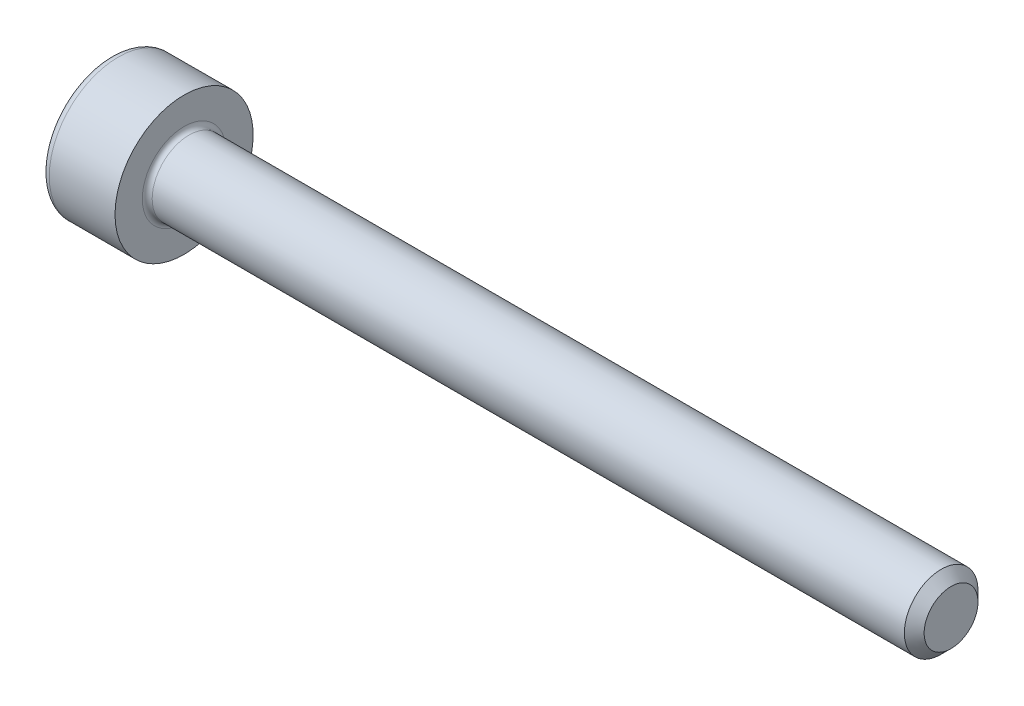
ISO-10303-21;
HEADER;
FILE_DESCRIPTION(('STEP AP214'),'2;1');
FILE_NAME('part.step','',(''),(''),'','','');
FILE_SCHEMA(('AUTOMOTIVE_DESIGN { 1 0 10303 214 1 1 1 1 }'));
ENDSEC;
DATA;
#1=APPLICATION_CONTEXT('core data for automotive mechanical design processes');
#2=APPLICATION_PROTOCOL_DEFINITION('international standard','automotive_design',2000,#1);
#3=PRODUCT_CONTEXT('',#1,'mechanical');
#4=PRODUCT('Part','Part','',(#3));
#5=PRODUCT_RELATED_PRODUCT_CATEGORY('part','',(#4));
#6=PRODUCT_DEFINITION_FORMATION('','',#4);
#7=PRODUCT_DEFINITION_CONTEXT('part definition',#1,'design');
#8=PRODUCT_DEFINITION('design','',#6,#7);
#9=PRODUCT_DEFINITION_SHAPE('','',#8);
#10=(LENGTH_UNIT() NAMED_UNIT(*) SI_UNIT(.MILLI.,.METRE.));
#11=(NAMED_UNIT(*) PLANE_ANGLE_UNIT() SI_UNIT($,.RADIAN.));
#12=(NAMED_UNIT(*) SI_UNIT($,.STERADIAN.) SOLID_ANGLE_UNIT());
#13=UNCERTAINTY_MEASURE_WITH_UNIT(LENGTH_MEASURE(1.E-05),#10,'distance_accuracy_value','');
#14=(GEOMETRIC_REPRESENTATION_CONTEXT(3) GLOBAL_UNCERTAINTY_ASSIGNED_CONTEXT((#13)) GLOBAL_UNIT_ASSIGNED_CONTEXT((#10,
#11,#12)) REPRESENTATION_CONTEXT('',''));
#15=CARTESIAN_POINT('',(0.,0.,0.));
#16=DIRECTION('',(0.,0.,1.));
#17=DIRECTION('',(1.,0.,0.));
#18=AXIS2_PLACEMENT_3D('',#15,#16,#17);
#19=CARTESIAN_POINT('',(0.,0.,0.));
#20=DIRECTION('',(-1.,0.,0.));
#21=DIRECTION('',(0.,0.,1.));
#22=AXIS2_PLACEMENT_3D('',#19,#20,#21);
#23=CYLINDRICAL_SURFACE('',#22,1.39568824458778);
#24=CARTESIAN_POINT('',(0.16,0.,0.));
#25=DIRECTION('',(1.,0.,0.));
#26=DIRECTION('',(0.,0.,-1.));
#27=AXIS2_PLACEMENT_3D('',#24,#25,#26);
#28=CIRCLE('',#27,1.39568824458778);
#29=CARTESIAN_POINT('',(0.16,0.,-1.39568824458778));
#30=VERTEX_POINT('',#29);
#31=EDGE_CURVE('E158',#30,#30,#28,.T.);
#32=ORIENTED_EDGE('',*,*,#31,.T.);
#33=EDGE_LOOP('',(#32));
#34=FACE_BOUND('',#33,.T.);
#35=CARTESIAN_POINT('',(1.48873412756029,0.,0.));
#36=DIRECTION('',(-1.,0.,0.));
#37=DIRECTION('',(0.,0.,1.));
#38=AXIS2_PLACEMENT_3D('',#35,#36,#37);
#39=CIRCLE('',#38,1.39568824458778);
#40=CARTESIAN_POINT('',(1.48873412756029,0.,1.39568824458778));
#41=VERTEX_POINT('',#40);
#42=EDGE_CURVE('E141',#41,#41,#39,.T.);
#43=ORIENTED_EDGE('',*,*,#42,.T.);
#44=EDGE_LOOP('',(#43));
#45=FACE_BOUND('',#44,.T.);
#46=ADVANCED_FACE('F39',(#34,#45),#23,.T.);
#47=CARTESIAN_POINT('',(0.,0.,0.));
#48=DIRECTION('',(1.,0.,0.));
#49=DIRECTION('',(0.,0.,-1.));
#50=AXIS2_PLACEMENT_3D('',#47,#48,#49);
#51=PLANE('',#50);
#52=DIRECTION('',(0.,-0.5,-0.866025403784439));
#53=VECTOR('',#52,1.);
#54=CARTESIAN_POINT('',(0.,0.877572409168232,0.));
#55=LINE('',#54,#53);
#56=CARTESIAN_POINT('',(0.,0.877572409168232,0.));
#57=VERTEX_POINT('',#56);
#58=CARTESIAN_POINT('',(0.,0.438786204584116,-0.760000000000001));
#59=VERTEX_POINT('',#58);
#60=EDGE_CURVE('E128',#57,#59,#55,.T.);
#61=ORIENTED_EDGE('',*,*,#60,.F.);
#62=DIRECTION('',(0.,0.5,-0.866025403784439));
#63=VECTOR('',#62,1.);
#64=CARTESIAN_POINT('',(0.,0.438786204584116,0.76));
#65=LINE('',#64,#63);
#66=CARTESIAN_POINT('',(0.,0.438786204584116,0.76));
#67=VERTEX_POINT('',#66);
#68=EDGE_CURVE('E54',#67,#57,#65,.T.);
#69=ORIENTED_EDGE('',*,*,#68,.F.);
#70=DIRECTION('',(0.,1.,0.));
#71=VECTOR('',#70,1.);
#72=CARTESIAN_POINT('',(0.,-0.438786204584116,0.76));
#73=LINE('',#72,#71);
#74=CARTESIAN_POINT('',(0.,-0.438786204584116,0.76));
#75=VERTEX_POINT('',#74);
#76=EDGE_CURVE('E137',#75,#67,#73,.T.);
#77=ORIENTED_EDGE('',*,*,#76,.F.);
#78=DIRECTION('',(0.,0.5,0.866025403784439));
#79=VECTOR('',#78,1.);
#80=CARTESIAN_POINT('',(0.,-0.877572409168232,0.));
#81=LINE('',#80,#79);
#82=CARTESIAN_POINT('',(0.,-0.877572409168232,0.));
#83=VERTEX_POINT('',#82);
#84=EDGE_CURVE('E135',#83,#75,#81,.T.);
#85=ORIENTED_EDGE('',*,*,#84,.F.);
#86=DIRECTION('',(0.,-0.5,0.866025403784438));
#87=VECTOR('',#86,1.);
#88=CARTESIAN_POINT('',(0.,-0.438786204584116,-0.760000000000001));
#89=LINE('',#88,#87);
#90=CARTESIAN_POINT('',(0.,-0.438786204584116,-0.760000000000001));
#91=VERTEX_POINT('',#90);
#92=EDGE_CURVE('E102',#91,#83,#89,.T.);
#93=ORIENTED_EDGE('',*,*,#92,.F.);
#94=DIRECTION('',(0.,-1.,0.));
#95=VECTOR('',#94,1.);
#96=CARTESIAN_POINT('',(0.,0.438786204584116,-0.760000000000001));
#97=LINE('',#96,#95);
#98=EDGE_CURVE('E131',#59,#91,#97,.T.);
#99=ORIENTED_EDGE('',*,*,#98,.F.);
#100=EDGE_LOOP('',(#61,#69,#77,#85,#93,#99));
#101=FACE_BOUND('',#100,.T.);
#102=CARTESIAN_POINT('',(0.,0.,0.));
#103=DIRECTION('',(1.,0.,0.));
#104=DIRECTION('',(0.,0.,-1.));
#105=AXIS2_PLACEMENT_3D('',#102,#103,#104);
#106=CIRCLE('',#105,1.23568824458778);
#107=CARTESIAN_POINT('',(0.,0.,-1.23568824458778));
#108=VERTEX_POINT('',#107);
#109=EDGE_CURVE('E155',#108,#108,#106,.F.);
#110=ORIENTED_EDGE('',*,*,#109,.T.);
#111=EDGE_LOOP('',(#110));
#112=FACE_BOUND('',#111,.T.);
#113=ADVANCED_FACE('F180',(#101,#112),#51,.F.);
#114=CARTESIAN_POINT('',(16.9887341275603,0.,0.));
#115=DIRECTION('',(-1.,0.,0.));
#116=DIRECTION('',(0.,0.,1.));
#117=AXIS2_PLACEMENT_3D('',#114,#115,#116);
#118=PLANE('',#117);
#119=CARTESIAN_POINT('',(16.9887341275603,0.,0.));
#120=DIRECTION('',(-1.,0.,0.));
#121=DIRECTION('',(0.,0.,1.));
#122=AXIS2_PLACEMENT_3D('',#119,#120,#121);
#123=CIRCLE('',#122,0.544367063780152);
#124=CARTESIAN_POINT('',(16.9887341275603,0.,0.544367063780152));
#125=VERTEX_POINT('',#124);
#126=EDGE_CURVE('E11',#125,#125,#123,.F.);
#127=ORIENTED_EDGE('',*,*,#126,.T.);
#128=EDGE_LOOP('',(#127));
#129=FACE_BOUND('',#128,.T.);
#130=ADVANCED_FACE('F186',(#129),#118,.F.);
#131=CARTESIAN_POINT('',(0.,0.,0.));
#132=DIRECTION('',(-1.,0.,0.));
#133=DIRECTION('',(0.,0.,1.));
#134=AXIS2_PLACEMENT_3D('',#131,#132,#133);
#135=CYLINDRICAL_SURFACE('',#134,0.744367063780147);
#136=CARTESIAN_POINT('',(16.7887341275603,0.,0.));
#137=DIRECTION('',(-1.,0.,0.));
#138=DIRECTION('',(0.,0.,1.));
#139=AXIS2_PLACEMENT_3D('',#136,#137,#138);
#140=CIRCLE('',#139,0.744367063780147);
#141=CARTESIAN_POINT('',(16.7887341275603,0.,0.744367063780147));
#142=VERTEX_POINT('',#141);
#143=EDGE_CURVE('E47',#142,#142,#140,.T.);
#144=ORIENTED_EDGE('',*,*,#143,.T.);
#145=EDGE_LOOP('',(#144));
#146=FACE_BOUND('',#145,.T.);
#147=CARTESIAN_POINT('',(1.58873412756029,0.,0.));
#148=DIRECTION('',(-1.,0.,0.));
#149=DIRECTION('',(0.,0.,1.));
#150=AXIS2_PLACEMENT_3D('',#147,#148,#149);
#151=CIRCLE('',#150,0.744367063780147);
#152=CARTESIAN_POINT('',(1.58873412756029,0.,0.744367063780147));
#153=VERTEX_POINT('',#152);
#154=EDGE_CURVE('E152',#153,#153,#151,.F.);
#155=ORIENTED_EDGE('',*,*,#154,.T.);
#156=EDGE_LOOP('',(#155));
#157=FACE_BOUND('',#156,.T.);
#158=ADVANCED_FACE('F163',(#146,#157),#135,.T.);
#159=CARTESIAN_POINT('',(1.48873412756029,0.,0.));
#160=DIRECTION('',(-1.,0.,0.));
#161=DIRECTION('',(0.,0.,1.));
#162=AXIS2_PLACEMENT_3D('',#159,#160,#161);
#163=PLANE('',#162);
#164=CARTESIAN_POINT('',(1.48873412756029,0.,0.));
#165=DIRECTION('',(-1.,0.,0.));
#166=DIRECTION('',(0.,0.,1.));
#167=AXIS2_PLACEMENT_3D('',#164,#165,#166);
#168=CIRCLE('',#167,0.844367063780147);
#169=CARTESIAN_POINT('',(1.48873412756029,0.,0.844367063780147));
#170=VERTEX_POINT('',#169);
#171=EDGE_CURVE('E149',#170,#170,#168,.T.);
#172=ORIENTED_EDGE('',*,*,#171,.T.);
#173=EDGE_LOOP('',(#172));
#174=FACE_BOUND('',#173,.T.);
#175=ORIENTED_EDGE('',*,*,#42,.F.);
#176=EDGE_LOOP('',(#175));
#177=FACE_BOUND('',#176,.T.);
#178=ADVANCED_FACE('F193',(#174,#177),#163,.F.);
#179=CARTESIAN_POINT('',(1.58873412756029,0.,0.));
#180=DIRECTION('',(-1.,0.,0.));
#181=DIRECTION('',(0.,0.,1.));
#182=AXIS2_PLACEMENT_3D('',#179,#180,#181);
#183=TOROIDAL_SURFACE('',#182,0.844367063780147,0.1);
#184=ORIENTED_EDGE('',*,*,#154,.F.);
#185=EDGE_LOOP('',(#184));
#186=FACE_BOUND('',#185,.T.);
#187=ORIENTED_EDGE('',*,*,#171,.F.);
#188=EDGE_LOOP('',(#187));
#189=FACE_BOUND('',#188,.T.);
#190=ADVANCED_FACE('F176',(#186,#189),#183,.F.);
#191=CARTESIAN_POINT('',(0.16,0.,0.));
#192=DIRECTION('',(1.,0.,0.));
#193=DIRECTION('',(0.,0.,-1.));
#194=AXIS2_PLACEMENT_3D('',#191,#192,#193);
#195=TOROIDAL_SURFACE('',#194,1.23568824458778,0.16);
#196=ORIENTED_EDGE('',*,*,#31,.F.);
#197=EDGE_LOOP('',(#196));
#198=FACE_BOUND('',#197,.T.);
#199=ORIENTED_EDGE('',*,*,#109,.F.);
#200=EDGE_LOOP('',(#199));
#201=FACE_BOUND('',#200,.T.);
#202=ADVANCED_FACE('F168',(#198,#201),#195,.T.);
#203=CARTESIAN_POINT('',(16.7887341275603,0.,0.));
#204=DIRECTION('',(-1.,0.,0.));
#205=DIRECTION('',(0.,0.,1.));
#206=AXIS2_PLACEMENT_3D('',#203,#204,#205);
#207=CONICAL_SURFACE('',#206,0.744367063780147,0.78539816339744);
#208=ORIENTED_EDGE('',*,*,#126,.F.);
#209=EDGE_LOOP('',(#208));
#210=FACE_BOUND('',#209,.T.);
#211=ORIENTED_EDGE('',*,*,#143,.F.);
#212=EDGE_LOOP('',(#211));
#213=FACE_BOUND('',#212,.T.);
#214=ADVANCED_FACE('F41',(#210,#213),#207,.T.);
#215=CARTESIAN_POINT('',(0.7,0.438786204584116,0.76));
#216=DIRECTION('',(0.,0.866025403784439,0.5));
#217=DIRECTION('',(0.,-0.5,0.866025403784439));
#218=AXIS2_PLACEMENT_3D('',#215,#216,#217);
#219=PLANE('',#218);
#220=ORIENTED_EDGE('',*,*,#68,.T.);
#221=DIRECTION('',(-1.,0.,0.));
#222=VECTOR('',#221,1.);
#223=CARTESIAN_POINT('',(0.7,0.877572409168232,0.));
#224=LINE('',#223,#222);
#225=CARTESIAN_POINT('',(0.7,0.877572409168232,0.));
#226=VERTEX_POINT('',#225);
#227=EDGE_CURVE('E84',#226,#57,#224,.T.);
#228=ORIENTED_EDGE('',*,*,#227,.F.);
#229=DIRECTION('',(0.,0.5,-0.866025403784439));
#230=VECTOR('',#229,1.);
#231=CARTESIAN_POINT('',(0.7,0.438786204584116,0.76));
#232=LINE('',#231,#230);
#233=CARTESIAN_POINT('',(0.7,0.438786204584116,0.76));
#234=VERTEX_POINT('',#233);
#235=EDGE_CURVE('E139',#234,#226,#232,.T.);
#236=ORIENTED_EDGE('',*,*,#235,.F.);
#237=DIRECTION('',(-1.,0.,0.));
#238=VECTOR('',#237,1.);
#239=CARTESIAN_POINT('',(0.7,0.438786204584116,0.76));
#240=LINE('',#239,#238);
#241=EDGE_CURVE('E62',#234,#67,#240,.T.);
#242=ORIENTED_EDGE('',*,*,#241,.T.);
#243=EDGE_LOOP('',(#220,#228,#236,#242));
#244=FACE_BOUND('',#243,.T.);
#245=ADVANCED_FACE('F167',(#244),#219,.F.);
#246=CARTESIAN_POINT('',(0.7,-0.438786204584116,0.76));
#247=DIRECTION('',(0.,0.,1.));
#248=DIRECTION('',(1.,0.,0.));
#249=AXIS2_PLACEMENT_3D('',#246,#247,#248);
#250=PLANE('',#249);
#251=ORIENTED_EDGE('',*,*,#76,.T.);
#252=ORIENTED_EDGE('',*,*,#241,.F.);
#253=DIRECTION('',(0.,1.,0.));
#254=VECTOR('',#253,1.);
#255=CARTESIAN_POINT('',(0.7,-0.438786204584116,0.76));
#256=LINE('',#255,#254);
#257=CARTESIAN_POINT('',(0.7,-0.438786204584116,0.76));
#258=VERTEX_POINT('',#257);
#259=EDGE_CURVE('E114',#258,#234,#256,.T.);
#260=ORIENTED_EDGE('',*,*,#259,.F.);
#261=DIRECTION('',(-1.,0.,0.));
#262=VECTOR('',#261,1.);
#263=CARTESIAN_POINT('',(0.7,-0.438786204584116,0.76));
#264=LINE('',#263,#262);
#265=EDGE_CURVE('E106',#258,#75,#264,.T.);
#266=ORIENTED_EDGE('',*,*,#265,.T.);
#267=EDGE_LOOP('',(#251,#252,#260,#266));
#268=FACE_BOUND('',#267,.T.);
#269=ADVANCED_FACE('F174',(#268),#250,.F.);
#270=CARTESIAN_POINT('',(0.7,-0.877572409168232,0.));
#271=DIRECTION('',(0.,-0.866025403784439,0.5));
#272=DIRECTION('',(0.,-0.5,-0.866025403784439));
#273=AXIS2_PLACEMENT_3D('',#270,#271,#272);
#274=PLANE('',#273);
#275=ORIENTED_EDGE('',*,*,#84,.T.);
#276=ORIENTED_EDGE('',*,*,#265,.F.);
#277=DIRECTION('',(0.,0.5,0.866025403784439));
#278=VECTOR('',#277,1.);
#279=CARTESIAN_POINT('',(0.7,-0.877572409168232,0.));
#280=LINE('',#279,#278);
#281=CARTESIAN_POINT('',(0.7,-0.877572409168232,0.));
#282=VERTEX_POINT('',#281);
#283=EDGE_CURVE('E110',#282,#258,#280,.T.);
#284=ORIENTED_EDGE('',*,*,#283,.F.);
#285=DIRECTION('',(-1.,0.,0.));
#286=VECTOR('',#285,1.);
#287=CARTESIAN_POINT('',(0.7,-0.877572409168232,0.));
#288=LINE('',#287,#286);
#289=EDGE_CURVE('E95',#282,#83,#288,.T.);
#290=ORIENTED_EDGE('',*,*,#289,.T.);
#291=EDGE_LOOP('',(#275,#276,#284,#290));
#292=FACE_BOUND('',#291,.T.);
#293=ADVANCED_FACE('F111',(#292),#274,.F.);
#294=CARTESIAN_POINT('',(0.7,-0.438786204584116,-0.760000000000001));
#295=DIRECTION('',(0.,-0.866025403784438,-0.5));
#296=DIRECTION('',(0.,0.5,-0.866025403784438));
#297=AXIS2_PLACEMENT_3D('',#294,#295,#296);
#298=PLANE('',#297);
#299=ORIENTED_EDGE('',*,*,#92,.T.);
#300=ORIENTED_EDGE('',*,*,#289,.F.);
#301=DIRECTION('',(0.,-0.5,0.866025403784438));
#302=VECTOR('',#301,1.);
#303=CARTESIAN_POINT('',(0.7,-0.438786204584116,-0.760000000000001));
#304=LINE('',#303,#302);
#305=CARTESIAN_POINT('',(0.7,-0.438786204584116,-0.760000000000001));
#306=VERTEX_POINT('',#305);
#307=EDGE_CURVE('E99',#306,#282,#304,.T.);
#308=ORIENTED_EDGE('',*,*,#307,.F.);
#309=DIRECTION('',(-1.,0.,0.));
#310=VECTOR('',#309,1.);
#311=CARTESIAN_POINT('',(0.7,-0.438786204584116,-0.760000000000001));
#312=LINE('',#311,#310);
#313=EDGE_CURVE('E107',#306,#91,#312,.T.);
#314=ORIENTED_EDGE('',*,*,#313,.T.);
#315=EDGE_LOOP('',(#299,#300,#308,#314));
#316=FACE_BOUND('',#315,.T.);
#317=ADVANCED_FACE('F97',(#316),#298,.F.);
#318=CARTESIAN_POINT('',(0.7,0.438786204584116,-0.760000000000001));
#319=DIRECTION('',(0.,0.,-1.));
#320=DIRECTION('',(0.,1.,0.));
#321=AXIS2_PLACEMENT_3D('',#318,#319,#320);
#322=PLANE('',#321);
#323=ORIENTED_EDGE('',*,*,#98,.T.);
#324=ORIENTED_EDGE('',*,*,#313,.F.);
#325=DIRECTION('',(0.,-1.,0.));
#326=VECTOR('',#325,1.);
#327=CARTESIAN_POINT('',(0.7,0.438786204584116,-0.760000000000001));
#328=LINE('',#327,#326);
#329=CARTESIAN_POINT('',(0.7,0.438786204584116,-0.760000000000001));
#330=VERTEX_POINT('',#329);
#331=EDGE_CURVE('E120',#330,#306,#328,.T.);
#332=ORIENTED_EDGE('',*,*,#331,.F.);
#333=DIRECTION('',(-1.,0.,0.));
#334=VECTOR('',#333,1.);
#335=CARTESIAN_POINT('',(0.7,0.438786204584116,-0.760000000000001));
#336=LINE('',#335,#334);
#337=EDGE_CURVE('E144',#330,#59,#336,.T.);
#338=ORIENTED_EDGE('',*,*,#337,.T.);
#339=EDGE_LOOP('',(#323,#324,#332,#338));
#340=FACE_BOUND('',#339,.T.);
#341=ADVANCED_FACE('F215',(#340),#322,.F.);
#342=CARTESIAN_POINT('',(0.7,0.877572409168232,0.));
#343=DIRECTION('',(0.,0.866025403784439,-0.5));
#344=DIRECTION('',(0.,0.5,0.866025403784439));
#345=AXIS2_PLACEMENT_3D('',#342,#343,#344);
#346=PLANE('',#345);
#347=ORIENTED_EDGE('',*,*,#60,.T.);
#348=ORIENTED_EDGE('',*,*,#337,.F.);
#349=DIRECTION('',(0.,-0.5,-0.866025403784439));
#350=VECTOR('',#349,1.);
#351=CARTESIAN_POINT('',(0.7,0.877572409168232,0.));
#352=LINE('',#351,#350);
#353=EDGE_CURVE('E122',#226,#330,#352,.T.);
#354=ORIENTED_EDGE('',*,*,#353,.F.);
#355=ORIENTED_EDGE('',*,*,#227,.T.);
#356=EDGE_LOOP('',(#347,#348,#354,#355));
#357=FACE_BOUND('',#356,.T.);
#358=ADVANCED_FACE('F212',(#357),#346,.F.);
#359=CARTESIAN_POINT('',(0.7,0.,0.));
#360=DIRECTION('',(-1.,0.,0.));
#361=DIRECTION('',(0.,0.,1.));
#362=AXIS2_PLACEMENT_3D('',#359,#360,#361);
#363=PLANE('',#362);
#364=ORIENTED_EDGE('',*,*,#235,.T.);
#365=ORIENTED_EDGE('',*,*,#353,.T.);
#366=ORIENTED_EDGE('',*,*,#331,.T.);
#367=ORIENTED_EDGE('',*,*,#307,.T.);
#368=ORIENTED_EDGE('',*,*,#283,.T.);
#369=ORIENTED_EDGE('',*,*,#259,.T.);
#370=EDGE_LOOP('',(#364,#365,#366,#367,#368,#369));
#371=FACE_BOUND('',#370,.T.);
#372=ADVANCED_FACE('F117',(#371),#363,.T.);
#373=CLOSED_SHELL('',(#46,#113,#130,#158,#178,#190,#202,#214,#245,#269,#293,#317,#341,#358,#372));
#374=MANIFOLD_SOLID_BREP('B2',#373);
#375=ADVANCED_BREP_SHAPE_REPRESENTATION('',(#18,#374),#14);
#376=SHAPE_DEFINITION_REPRESENTATION(#9,#375);
ENDSEC;
END-ISO-10303-21;
